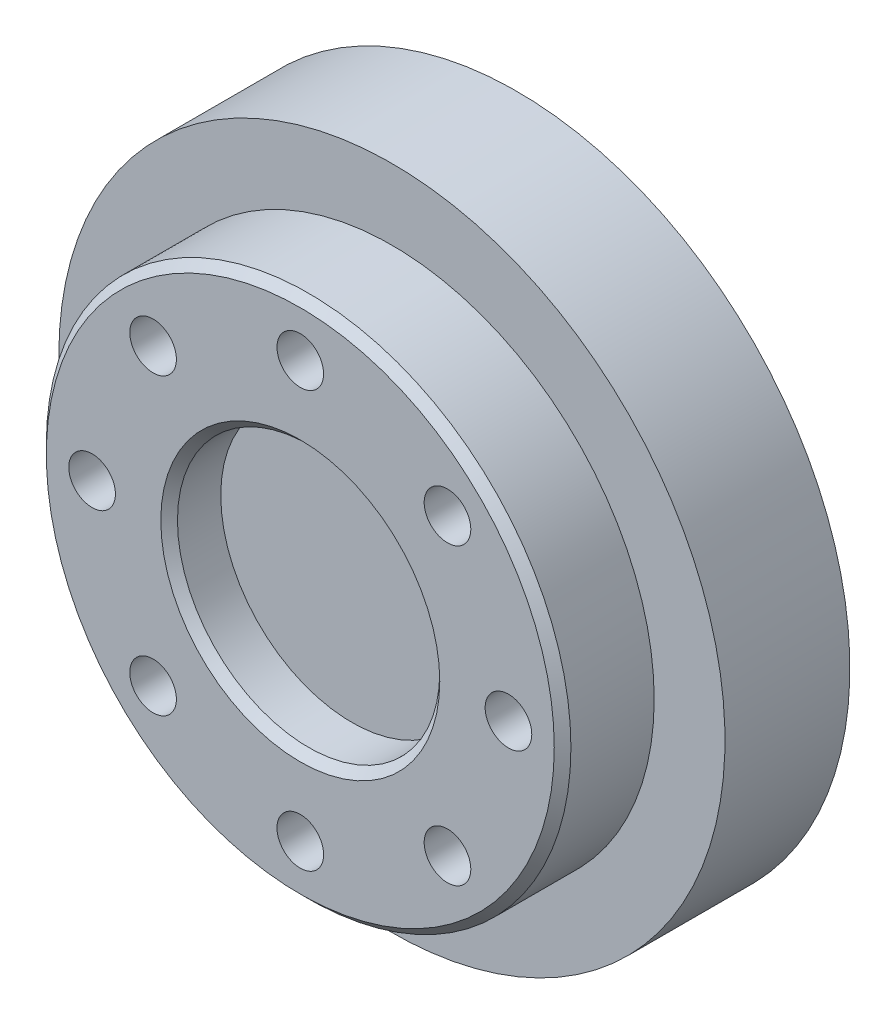
ISO-10303-21;
HEADER;
FILE_DESCRIPTION(('STEP AP214'),'2;1');
FILE_NAME('part.step','',(''),(''),'','','');
FILE_SCHEMA(('AUTOMOTIVE_DESIGN { 1 0 10303 214 1 1 1 1 }'));
ENDSEC;
DATA;
#1=APPLICATION_CONTEXT('core data for automotive mechanical design processes');
#2=APPLICATION_PROTOCOL_DEFINITION('international standard','automotive_design',2000,#1);
#3=PRODUCT_CONTEXT('',#1,'mechanical');
#4=PRODUCT('Part','Part','',(#3));
#5=PRODUCT_RELATED_PRODUCT_CATEGORY('part','',(#4));
#6=PRODUCT_DEFINITION_FORMATION('','',#4);
#7=PRODUCT_DEFINITION_CONTEXT('part definition',#1,'design');
#8=PRODUCT_DEFINITION('design','',#6,#7);
#9=PRODUCT_DEFINITION_SHAPE('','',#8);
#10=(LENGTH_UNIT() NAMED_UNIT(*) SI_UNIT(.MILLI.,.METRE.));
#11=(NAMED_UNIT(*) PLANE_ANGLE_UNIT() SI_UNIT($,.RADIAN.));
#12=(NAMED_UNIT(*) SI_UNIT($,.STERADIAN.) SOLID_ANGLE_UNIT());
#13=UNCERTAINTY_MEASURE_WITH_UNIT(LENGTH_MEASURE(1.E-05),#10,'distance_accuracy_value','');
#14=(GEOMETRIC_REPRESENTATION_CONTEXT(3) GLOBAL_UNCERTAINTY_ASSIGNED_CONTEXT((#13)) GLOBAL_UNIT_ASSIGNED_CONTEXT((#10,
#11,#12)) REPRESENTATION_CONTEXT('',''));
#15=CARTESIAN_POINT('',(0.,0.,0.));
#16=DIRECTION('',(0.,0.,1.));
#17=DIRECTION('',(1.,0.,0.));
#18=AXIS2_PLACEMENT_3D('',#15,#16,#17);
#19=CARTESIAN_POINT('',(0.,0.,-11.));
#20=DIRECTION('',(0.,0.,1.));
#21=DIRECTION('',(1.,0.,0.));
#22=AXIS2_PLACEMENT_3D('',#19,#20,#21);
#23=CYLINDRICAL_SURFACE('',#22,31.5);
#24=CARTESIAN_POINT('',(0.,0.,-1.00000000000004));
#25=DIRECTION('',(0.,0.,1.));
#26=DIRECTION('',(1.,0.,0.));
#27=AXIS2_PLACEMENT_3D('',#24,#25,#26);
#28=CIRCLE('',#27,31.5);
#29=CARTESIAN_POINT('',(31.5,0.,-1.00000000000004));
#30=VERTEX_POINT('',#29);
#31=EDGE_CURVE('E49',#30,#30,#28,.F.);
#32=ORIENTED_EDGE('',*,*,#31,.T.);
#33=EDGE_LOOP('',(#32));
#34=FACE_BOUND('',#33,.T.);
#35=CARTESIAN_POINT('',(0.,0.,-11.));
#36=DIRECTION('',(0.,0.,1.));
#37=DIRECTION('',(1.,0.,0.));
#38=AXIS2_PLACEMENT_3D('',#35,#36,#37);
#39=CIRCLE('',#38,31.5);
#40=CARTESIAN_POINT('',(31.5,0.,-11.));
#41=VERTEX_POINT('',#40);
#42=EDGE_CURVE('E59',#41,#41,#39,.T.);
#43=ORIENTED_EDGE('',*,*,#42,.T.);
#44=EDGE_LOOP('',(#43));
#45=FACE_BOUND('',#44,.T.);
#46=ADVANCED_FACE('F37',(#34,#45),#23,.T.);
#47=CARTESIAN_POINT('',(0.,0.,0.));
#48=DIRECTION('',(0.,0.,1.));
#49=DIRECTION('',(1.,0.,0.));
#50=AXIS2_PLACEMENT_3D('',#47,#48,#49);
#51=PLANE('',#50);
#52=CARTESIAN_POINT('',(0.,0.,0.));
#53=DIRECTION('',(0.,0.,1.));
#54=DIRECTION('',(1.,0.,0.));
#55=AXIS2_PLACEMENT_3D('',#52,#53,#54);
#56=CIRCLE('',#55,16.7500000000001);
#57=CARTESIAN_POINT('',(16.7500000000001,0.,0.));
#58=VERTEX_POINT('',#57);
#59=EDGE_CURVE('E10',#58,#58,#56,.F.);
#60=ORIENTED_EDGE('',*,*,#59,.T.);
#61=EDGE_LOOP('',(#60));
#62=FACE_BOUND('',#61,.T.);
#63=CARTESIAN_POINT('',(0.,0.,0.));
#64=DIRECTION('',(0.,0.,1.));
#65=DIRECTION('',(1.,0.,0.));
#66=AXIS2_PLACEMENT_3D('',#63,#64,#65);
#67=CIRCLE('',#66,30.5);
#68=CARTESIAN_POINT('',(30.5,0.,0.));
#69=VERTEX_POINT('',#68);
#70=EDGE_CURVE('E53',#69,#69,#67,.T.);
#71=ORIENTED_EDGE('',*,*,#70,.T.);
#72=EDGE_LOOP('',(#71));
#73=FACE_BOUND('',#72,.T.);
#74=CARTESIAN_POINT('',(0.,25.,0.));
#75=DIRECTION('',(0.,0.,1.));
#76=DIRECTION('',(1.,0.,0.));
#77=AXIS2_PLACEMENT_3D('',#74,#75,#76);
#78=CIRCLE('',#77,2.8);
#79=CARTESIAN_POINT('',(2.8,25.,0.));
#80=VERTEX_POINT('',#79);
#81=EDGE_CURVE('E106',#80,#80,#78,.T.);
#82=ORIENTED_EDGE('',*,*,#81,.F.);
#83=EDGE_LOOP('',(#82));
#84=FACE_BOUND('',#83,.T.);
#85=CARTESIAN_POINT('',(17.6776695296637,17.6776695296637,0.));
#86=DIRECTION('',(0.,0.,1.));
#87=DIRECTION('',(1.,0.,0.));
#88=AXIS2_PLACEMENT_3D('',#85,#86,#87);
#89=CIRCLE('',#88,2.8);
#90=CARTESIAN_POINT('',(20.4776695296637,17.6776695296637,0.));
#91=VERTEX_POINT('',#90);
#92=EDGE_CURVE('E103',#91,#91,#89,.T.);
#93=ORIENTED_EDGE('',*,*,#92,.F.);
#94=EDGE_LOOP('',(#93));
#95=FACE_BOUND('',#94,.T.);
#96=CARTESIAN_POINT('',(25.,0.,0.));
#97=DIRECTION('',(0.,0.,1.));
#98=DIRECTION('',(1.,0.,0.));
#99=AXIS2_PLACEMENT_3D('',#96,#97,#98);
#100=CIRCLE('',#99,2.8);
#101=CARTESIAN_POINT('',(27.8,0.,0.));
#102=VERTEX_POINT('',#101);
#103=EDGE_CURVE('E97',#102,#102,#100,.T.);
#104=ORIENTED_EDGE('',*,*,#103,.F.);
#105=EDGE_LOOP('',(#104));
#106=FACE_BOUND('',#105,.T.);
#107=CARTESIAN_POINT('',(17.6776695296636,-17.6776695296638,0.));
#108=DIRECTION('',(0.,0.,1.));
#109=DIRECTION('',(1.,0.,0.));
#110=AXIS2_PLACEMENT_3D('',#107,#108,#109);
#111=CIRCLE('',#110,2.8);
#112=CARTESIAN_POINT('',(20.4776695296636,-17.6776695296638,0.));
#113=VERTEX_POINT('',#112);
#114=EDGE_CURVE('E91',#113,#113,#111,.T.);
#115=ORIENTED_EDGE('',*,*,#114,.F.);
#116=EDGE_LOOP('',(#115));
#117=FACE_BOUND('',#116,.T.);
#118=CARTESIAN_POINT('',(-1.74574066942157E-13,-25.,0.));
#119=DIRECTION('',(0.,0.,1.));
#120=DIRECTION('',(1.,0.,0.));
#121=AXIS2_PLACEMENT_3D('',#118,#119,#120);
#122=CIRCLE('',#121,2.8);
#123=CARTESIAN_POINT('',(2.79999999999983,-25.,0.));
#124=VERTEX_POINT('',#123);
#125=EDGE_CURVE('E85',#124,#124,#122,.T.);
#126=ORIENTED_EDGE('',*,*,#125,.F.);
#127=EDGE_LOOP('',(#126));
#128=FACE_BOUND('',#127,.T.);
#129=CARTESIAN_POINT('',(-17.6776695296638,-17.6776695296635,0.));
#130=DIRECTION('',(0.,0.,1.));
#131=DIRECTION('',(1.,0.,0.));
#132=AXIS2_PLACEMENT_3D('',#129,#130,#131);
#133=CIRCLE('',#132,2.8);
#134=CARTESIAN_POINT('',(-14.8776695296638,-17.6776695296635,0.));
#135=VERTEX_POINT('',#134);
#136=EDGE_CURVE('E79',#135,#135,#133,.T.);
#137=ORIENTED_EDGE('',*,*,#136,.F.);
#138=EDGE_LOOP('',(#137));
#139=FACE_BOUND('',#138,.T.);
#140=CARTESIAN_POINT('',(-25.,2.61861100413235E-13,0.));
#141=DIRECTION('',(0.,0.,1.));
#142=DIRECTION('',(1.,0.,0.));
#143=AXIS2_PLACEMENT_3D('',#140,#141,#142);
#144=CIRCLE('',#143,2.8);
#145=CARTESIAN_POINT('',(-22.2,2.61861100413235E-13,0.));
#146=VERTEX_POINT('',#145);
#147=EDGE_CURVE('E73',#146,#146,#144,.T.);
#148=ORIENTED_EDGE('',*,*,#147,.F.);
#149=EDGE_LOOP('',(#148));
#150=FACE_BOUND('',#149,.T.);
#151=CARTESIAN_POINT('',(-17.6776695296635,17.6776695296639,0.));
#152=DIRECTION('',(0.,0.,1.));
#153=DIRECTION('',(1.,0.,0.));
#154=AXIS2_PLACEMENT_3D('',#151,#152,#153);
#155=CIRCLE('',#154,2.8);
#156=CARTESIAN_POINT('',(-14.8776695296635,17.6776695296639,0.));
#157=VERTEX_POINT('',#156);
#158=EDGE_CURVE('E67',#157,#157,#155,.T.);
#159=ORIENTED_EDGE('',*,*,#158,.F.);
#160=EDGE_LOOP('',(#159));
#161=FACE_BOUND('',#160,.T.);
#162=ADVANCED_FACE('F137',(#62,#73,#84,#95,#106,#117,#128,#139,#150,#161),#51,.T.);
#163=CARTESIAN_POINT('',(-17.6776695296635,17.6776695296639,-9.));
#164=DIRECTION('',(0.,0.,1.));
#165=DIRECTION('',(1.,0.,0.));
#166=AXIS2_PLACEMENT_3D('',#163,#164,#165);
#167=CYLINDRICAL_SURFACE('',#166,2.8);
#168=CARTESIAN_POINT('',(-17.6776695296635,17.6776695296639,-9.));
#169=DIRECTION('',(0.,0.,1.));
#170=DIRECTION('',(1.,0.,0.));
#171=AXIS2_PLACEMENT_3D('',#168,#169,#170);
#172=CIRCLE('',#171,2.8);
#173=CARTESIAN_POINT('',(-14.8776695296635,17.6776695296639,-9.));
#174=VERTEX_POINT('',#173);
#175=EDGE_CURVE('E64',#174,#174,#172,.T.);
#176=ORIENTED_EDGE('',*,*,#175,.F.);
#177=EDGE_LOOP('',(#176));
#178=FACE_BOUND('',#177,.T.);
#179=ORIENTED_EDGE('',*,*,#158,.T.);
#180=EDGE_LOOP('',(#179));
#181=FACE_BOUND('',#180,.T.);
#182=ADVANCED_FACE('F143',(#178,#181),#167,.F.);
#183=CARTESIAN_POINT('',(-17.6776695296635,17.6776695296639,-9.));
#184=DIRECTION('',(0.,0.,1.));
#185=DIRECTION('',(1.,0.,0.));
#186=AXIS2_PLACEMENT_3D('',#183,#184,#185);
#187=PLANE('',#186);
#188=ORIENTED_EDGE('',*,*,#175,.T.);
#189=EDGE_LOOP('',(#188));
#190=FACE_BOUND('',#189,.T.);
#191=ADVANCED_FACE('F184',(#190),#187,.T.);
#192=CARTESIAN_POINT('',(-25.,2.61861100413235E-13,-9.));
#193=DIRECTION('',(0.,0.,1.));
#194=DIRECTION('',(1.,0.,0.));
#195=AXIS2_PLACEMENT_3D('',#192,#193,#194);
#196=CYLINDRICAL_SURFACE('',#195,2.8);
#197=CARTESIAN_POINT('',(-25.,2.61861100413235E-13,-9.));
#198=DIRECTION('',(0.,0.,1.));
#199=DIRECTION('',(1.,0.,0.));
#200=AXIS2_PLACEMENT_3D('',#197,#198,#199);
#201=CIRCLE('',#200,2.8);
#202=CARTESIAN_POINT('',(-22.2,2.61861100413235E-13,-9.));
#203=VERTEX_POINT('',#202);
#204=EDGE_CURVE('E70',#203,#203,#201,.T.);
#205=ORIENTED_EDGE('',*,*,#204,.F.);
#206=EDGE_LOOP('',(#205));
#207=FACE_BOUND('',#206,.T.);
#208=ORIENTED_EDGE('',*,*,#147,.T.);
#209=EDGE_LOOP('',(#208));
#210=FACE_BOUND('',#209,.T.);
#211=ADVANCED_FACE('F190',(#207,#210),#196,.F.);
#212=CARTESIAN_POINT('',(-25.,2.61861100413235E-13,-9.));
#213=DIRECTION('',(0.,0.,1.));
#214=DIRECTION('',(1.,0.,0.));
#215=AXIS2_PLACEMENT_3D('',#212,#213,#214);
#216=PLANE('',#215);
#217=ORIENTED_EDGE('',*,*,#204,.T.);
#218=EDGE_LOOP('',(#217));
#219=FACE_BOUND('',#218,.T.);
#220=ADVANCED_FACE('F194',(#219),#216,.T.);
#221=CARTESIAN_POINT('',(-17.6776695296638,-17.6776695296635,-9.));
#222=DIRECTION('',(0.,0.,1.));
#223=DIRECTION('',(1.,0.,0.));
#224=AXIS2_PLACEMENT_3D('',#221,#222,#223);
#225=CYLINDRICAL_SURFACE('',#224,2.8);
#226=CARTESIAN_POINT('',(-17.6776695296638,-17.6776695296635,-9.));
#227=DIRECTION('',(0.,0.,1.));
#228=DIRECTION('',(1.,0.,0.));
#229=AXIS2_PLACEMENT_3D('',#226,#227,#228);
#230=CIRCLE('',#229,2.8);
#231=CARTESIAN_POINT('',(-14.8776695296638,-17.6776695296635,-9.));
#232=VERTEX_POINT('',#231);
#233=EDGE_CURVE('E76',#232,#232,#230,.T.);
#234=ORIENTED_EDGE('',*,*,#233,.F.);
#235=EDGE_LOOP('',(#234));
#236=FACE_BOUND('',#235,.T.);
#237=ORIENTED_EDGE('',*,*,#136,.T.);
#238=EDGE_LOOP('',(#237));
#239=FACE_BOUND('',#238,.T.);
#240=ADVANCED_FACE('F197',(#236,#239),#225,.F.);
#241=CARTESIAN_POINT('',(-17.6776695296638,-17.6776695296635,-9.));
#242=DIRECTION('',(0.,0.,1.));
#243=DIRECTION('',(1.,0.,0.));
#244=AXIS2_PLACEMENT_3D('',#241,#242,#243);
#245=PLANE('',#244);
#246=ORIENTED_EDGE('',*,*,#233,.T.);
#247=EDGE_LOOP('',(#246));
#248=FACE_BOUND('',#247,.T.);
#249=ADVANCED_FACE('F202',(#248),#245,.T.);
#250=CARTESIAN_POINT('',(-1.74574066942157E-13,-25.,-9.));
#251=DIRECTION('',(0.,0.,1.));
#252=DIRECTION('',(1.,0.,0.));
#253=AXIS2_PLACEMENT_3D('',#250,#251,#252);
#254=CYLINDRICAL_SURFACE('',#253,2.8);
#255=CARTESIAN_POINT('',(-1.74574066942157E-13,-25.,-9.));
#256=DIRECTION('',(0.,0.,1.));
#257=DIRECTION('',(1.,0.,0.));
#258=AXIS2_PLACEMENT_3D('',#255,#256,#257);
#259=CIRCLE('',#258,2.8);
#260=CARTESIAN_POINT('',(2.79999999999983,-25.,-9.));
#261=VERTEX_POINT('',#260);
#262=EDGE_CURVE('E82',#261,#261,#259,.T.);
#263=ORIENTED_EDGE('',*,*,#262,.F.);
#264=EDGE_LOOP('',(#263));
#265=FACE_BOUND('',#264,.T.);
#266=ORIENTED_EDGE('',*,*,#125,.T.);
#267=EDGE_LOOP('',(#266));
#268=FACE_BOUND('',#267,.T.);
#269=ADVANCED_FACE('F205',(#265,#268),#254,.F.);
#270=CARTESIAN_POINT('',(-1.74574066942157E-13,-25.,-9.));
#271=DIRECTION('',(0.,0.,1.));
#272=DIRECTION('',(1.,0.,0.));
#273=AXIS2_PLACEMENT_3D('',#270,#271,#272);
#274=PLANE('',#273);
#275=ORIENTED_EDGE('',*,*,#262,.T.);
#276=EDGE_LOOP('',(#275));
#277=FACE_BOUND('',#276,.T.);
#278=ADVANCED_FACE('F210',(#277),#274,.T.);
#279=CARTESIAN_POINT('',(17.6776695296636,-17.6776695296638,-9.));
#280=DIRECTION('',(0.,0.,1.));
#281=DIRECTION('',(1.,0.,0.));
#282=AXIS2_PLACEMENT_3D('',#279,#280,#281);
#283=CYLINDRICAL_SURFACE('',#282,2.8);
#284=CARTESIAN_POINT('',(17.6776695296636,-17.6776695296638,-9.));
#285=DIRECTION('',(0.,0.,1.));
#286=DIRECTION('',(1.,0.,0.));
#287=AXIS2_PLACEMENT_3D('',#284,#285,#286);
#288=CIRCLE('',#287,2.8);
#289=CARTESIAN_POINT('',(20.4776695296636,-17.6776695296638,-9.));
#290=VERTEX_POINT('',#289);
#291=EDGE_CURVE('E88',#290,#290,#288,.T.);
#292=ORIENTED_EDGE('',*,*,#291,.F.);
#293=EDGE_LOOP('',(#292));
#294=FACE_BOUND('',#293,.T.);
#295=ORIENTED_EDGE('',*,*,#114,.T.);
#296=EDGE_LOOP('',(#295));
#297=FACE_BOUND('',#296,.T.);
#298=ADVANCED_FACE('F213',(#294,#297),#283,.F.);
#299=CARTESIAN_POINT('',(17.6776695296636,-17.6776695296638,-9.));
#300=DIRECTION('',(0.,0.,1.));
#301=DIRECTION('',(1.,0.,0.));
#302=AXIS2_PLACEMENT_3D('',#299,#300,#301);
#303=PLANE('',#302);
#304=ORIENTED_EDGE('',*,*,#291,.T.);
#305=EDGE_LOOP('',(#304));
#306=FACE_BOUND('',#305,.T.);
#307=ADVANCED_FACE('F218',(#306),#303,.T.);
#308=CARTESIAN_POINT('',(25.,0.,-9.));
#309=DIRECTION('',(0.,0.,1.));
#310=DIRECTION('',(1.,0.,0.));
#311=AXIS2_PLACEMENT_3D('',#308,#309,#310);
#312=CYLINDRICAL_SURFACE('',#311,2.8);
#313=CARTESIAN_POINT('',(25.,0.,-9.));
#314=DIRECTION('',(0.,0.,1.));
#315=DIRECTION('',(1.,0.,0.));
#316=AXIS2_PLACEMENT_3D('',#313,#314,#315);
#317=CIRCLE('',#316,2.8);
#318=CARTESIAN_POINT('',(27.8,0.,-9.));
#319=VERTEX_POINT('',#318);
#320=EDGE_CURVE('E94',#319,#319,#317,.T.);
#321=ORIENTED_EDGE('',*,*,#320,.F.);
#322=EDGE_LOOP('',(#321));
#323=FACE_BOUND('',#322,.T.);
#324=ORIENTED_EDGE('',*,*,#103,.T.);
#325=EDGE_LOOP('',(#324));
#326=FACE_BOUND('',#325,.T.);
#327=ADVANCED_FACE('F221',(#323,#326),#312,.F.);
#328=CARTESIAN_POINT('',(25.,0.,-9.));
#329=DIRECTION('',(0.,0.,1.));
#330=DIRECTION('',(1.,0.,0.));
#331=AXIS2_PLACEMENT_3D('',#328,#329,#330);
#332=PLANE('',#331);
#333=ORIENTED_EDGE('',*,*,#320,.T.);
#334=EDGE_LOOP('',(#333));
#335=FACE_BOUND('',#334,.T.);
#336=ADVANCED_FACE('F226',(#335),#332,.T.);
#337=CARTESIAN_POINT('',(17.6776695296637,17.6776695296637,-9.));
#338=DIRECTION('',(0.,0.,1.));
#339=DIRECTION('',(1.,0.,0.));
#340=AXIS2_PLACEMENT_3D('',#337,#338,#339);
#341=CYLINDRICAL_SURFACE('',#340,2.8);
#342=CARTESIAN_POINT('',(17.6776695296637,17.6776695296637,-9.));
#343=DIRECTION('',(0.,0.,1.));
#344=DIRECTION('',(1.,0.,0.));
#345=AXIS2_PLACEMENT_3D('',#342,#343,#344);
#346=CIRCLE('',#345,2.8);
#347=CARTESIAN_POINT('',(20.4776695296637,17.6776695296637,-9.));
#348=VERTEX_POINT('',#347);
#349=EDGE_CURVE('E100',#348,#348,#346,.T.);
#350=ORIENTED_EDGE('',*,*,#349,.F.);
#351=EDGE_LOOP('',(#350));
#352=FACE_BOUND('',#351,.T.);
#353=ORIENTED_EDGE('',*,*,#92,.T.);
#354=EDGE_LOOP('',(#353));
#355=FACE_BOUND('',#354,.T.);
#356=ADVANCED_FACE('F229',(#352,#355),#341,.F.);
#357=CARTESIAN_POINT('',(17.6776695296637,17.6776695296637,-9.));
#358=DIRECTION('',(0.,0.,1.));
#359=DIRECTION('',(1.,0.,0.));
#360=AXIS2_PLACEMENT_3D('',#357,#358,#359);
#361=PLANE('',#360);
#362=ORIENTED_EDGE('',*,*,#349,.T.);
#363=EDGE_LOOP('',(#362));
#364=FACE_BOUND('',#363,.T.);
#365=ADVANCED_FACE('F234',(#364),#361,.T.);
#366=CARTESIAN_POINT('',(0.,25.,-9.));
#367=DIRECTION('',(0.,0.,1.));
#368=DIRECTION('',(1.,0.,0.));
#369=AXIS2_PLACEMENT_3D('',#366,#367,#368);
#370=CYLINDRICAL_SURFACE('',#369,2.8);
#371=CARTESIAN_POINT('',(0.,25.,-9.));
#372=DIRECTION('',(0.,0.,1.));
#373=DIRECTION('',(1.,0.,0.));
#374=AXIS2_PLACEMENT_3D('',#371,#372,#373);
#375=CIRCLE('',#374,2.8);
#376=CARTESIAN_POINT('',(2.8,25.,-9.));
#377=VERTEX_POINT('',#376);
#378=EDGE_CURVE('E58',#377,#377,#375,.T.);
#379=ORIENTED_EDGE('',*,*,#378,.F.);
#380=EDGE_LOOP('',(#379));
#381=FACE_BOUND('',#380,.T.);
#382=ORIENTED_EDGE('',*,*,#81,.T.);
#383=EDGE_LOOP('',(#382));
#384=FACE_BOUND('',#383,.T.);
#385=ADVANCED_FACE('F237',(#381,#384),#370,.F.);
#386=CARTESIAN_POINT('',(0.,25.,-9.));
#387=DIRECTION('',(0.,0.,1.));
#388=DIRECTION('',(1.,0.,0.));
#389=AXIS2_PLACEMENT_3D('',#386,#387,#388);
#390=PLANE('',#389);
#391=ORIENTED_EDGE('',*,*,#378,.T.);
#392=EDGE_LOOP('',(#391));
#393=FACE_BOUND('',#392,.T.);
#394=ADVANCED_FACE('F244',(#393),#390,.T.);
#395=CARTESIAN_POINT('',(0.,0.,-6.2));
#396=DIRECTION('',(0.,0.,1.));
#397=DIRECTION('',(1.,0.,0.));
#398=AXIS2_PLACEMENT_3D('',#395,#396,#397);
#399=CYLINDRICAL_SURFACE('',#398,15.75);
#400=CARTESIAN_POINT('',(0.,0.,-1.00000000000005));
#401=DIRECTION('',(0.,0.,1.));
#402=DIRECTION('',(1.,0.,0.));
#403=AXIS2_PLACEMENT_3D('',#400,#401,#402);
#404=CIRCLE('',#403,15.75);
#405=CARTESIAN_POINT('',(15.75,0.,-1.00000000000005));
#406=VERTEX_POINT('',#405);
#407=EDGE_CURVE('E45',#406,#406,#404,.T.);
#408=CARTESIAN_POINT('',(0.,0.,-6.2));
#409=DIRECTION('',(0.,0.,1.));
#410=DIRECTION('',(1.,0.,0.));
#411=AXIS2_PLACEMENT_3D('',#408,#409,#410);
#412=CIRCLE('',#411,15.75);
#413=CARTESIAN_POINT('',(15.75,0.,-6.2));
#414=VERTEX_POINT('',#413);
#415=EDGE_CURVE('E62',#414,#414,#412,.T.);
#416=CARTESIAN_POINT('',(15.75,0.,-1.00000000000005));
#417=CARTESIAN_POINT('',(15.75,0.,-1.05416666666672));
#418=CARTESIAN_POINT('',(15.75,0.,-1.10833333333339));
#419=CARTESIAN_POINT('',(15.75,0.,-1.21666666666672));
#420=CARTESIAN_POINT('',(15.75,0.,-1.27083333333338));
#421=CARTESIAN_POINT('',(15.75,0.,-1.37916666666672));
#422=CARTESIAN_POINT('',(15.75,0.,-1.43333333333338));
#423=CARTESIAN_POINT('',(15.75,0.,-1.54166666666671));
#424=CARTESIAN_POINT('',(15.75,0.,-1.59583333333338));
#425=CARTESIAN_POINT('',(15.75,0.,-1.70416666666671));
#426=CARTESIAN_POINT('',(15.75,0.,-1.75833333333338));
#427=CARTESIAN_POINT('',(15.75,0.,-1.86666666666671));
#428=CARTESIAN_POINT('',(15.75,0.,-1.92083333333338));
#429=CARTESIAN_POINT('',(15.75,0.,-2.02916666666671));
#430=CARTESIAN_POINT('',(15.75,0.,-2.08333333333338));
#431=CARTESIAN_POINT('',(15.75,0.,-2.19166666666671));
#432=CARTESIAN_POINT('',(15.75,0.,-2.24583333333337));
#433=CARTESIAN_POINT('',(15.75,0.,-2.35416666666671));
#434=CARTESIAN_POINT('',(15.75,0.,-2.40833333333337));
#435=CARTESIAN_POINT('',(15.75,0.,-2.5166666666667));
#436=CARTESIAN_POINT('',(15.75,0.,-2.57083333333337));
#437=CARTESIAN_POINT('',(15.75,0.,-2.6791666666667));
#438=CARTESIAN_POINT('',(15.75,0.,-2.73333333333337));
#439=CARTESIAN_POINT('',(15.75,0.,-2.8416666666667));
#440=CARTESIAN_POINT('',(15.75,0.,-2.89583333333337));
#441=CARTESIAN_POINT('',(15.75,0.,-3.0041666666667));
#442=CARTESIAN_POINT('',(15.75,0.,-3.05833333333337));
#443=CARTESIAN_POINT('',(15.75,0.,-3.1666666666667));
#444=CARTESIAN_POINT('',(15.75,0.,-3.22083333333336));
#445=CARTESIAN_POINT('',(15.75,0.,-3.3291666666667));
#446=CARTESIAN_POINT('',(15.75,0.,-3.38333333333336));
#447=CARTESIAN_POINT('',(15.75,0.,-3.49166666666669));
#448=CARTESIAN_POINT('',(15.75,0.,-3.54583333333336));
#449=CARTESIAN_POINT('',(15.75,0.,-3.65416666666669));
#450=CARTESIAN_POINT('',(15.75,0.,-3.70833333333336));
#451=CARTESIAN_POINT('',(15.75,0.,-3.81666666666669));
#452=CARTESIAN_POINT('',(15.75,0.,-3.87083333333336));
#453=CARTESIAN_POINT('',(15.75,0.,-3.97916666666669));
#454=CARTESIAN_POINT('',(15.75,0.,-4.03333333333336));
#455=CARTESIAN_POINT('',(15.75,0.,-4.14166666666669));
#456=CARTESIAN_POINT('',(15.75,0.,-4.19583333333335));
#457=CARTESIAN_POINT('',(15.75,0.,-4.30416666666669));
#458=CARTESIAN_POINT('',(15.75,0.,-4.35833333333335));
#459=CARTESIAN_POINT('',(15.75,0.,-4.46666666666668));
#460=CARTESIAN_POINT('',(15.75,0.,-4.52083333333335));
#461=CARTESIAN_POINT('',(15.75,0.,-4.62916666666668));
#462=CARTESIAN_POINT('',(15.75,0.,-4.68333333333335));
#463=CARTESIAN_POINT('',(15.75,0.,-4.79166666666668));
#464=CARTESIAN_POINT('',(15.75,0.,-4.84583333333335));
#465=CARTESIAN_POINT('',(15.75,0.,-4.95416666666668));
#466=CARTESIAN_POINT('',(15.75,0.,-5.00833333333335));
#467=CARTESIAN_POINT('',(15.75,0.,-5.11666666666668));
#468=CARTESIAN_POINT('',(15.75,0.,-5.17083333333334));
#469=CARTESIAN_POINT('',(15.75,0.,-5.27916666666668));
#470=CARTESIAN_POINT('',(15.75,0.,-5.33333333333334));
#471=CARTESIAN_POINT('',(15.75,0.,-5.44166666666667));
#472=CARTESIAN_POINT('',(15.75,0.,-5.49583333333334));
#473=CARTESIAN_POINT('',(15.75,0.,-5.60416666666667));
#474=CARTESIAN_POINT('',(15.75,0.,-5.65833333333334));
#475=CARTESIAN_POINT('',(15.75,0.,-5.76666666666667));
#476=CARTESIAN_POINT('',(15.75,0.,-5.82083333333334));
#477=CARTESIAN_POINT('',(15.75,0.,-5.92916666666667));
#478=CARTESIAN_POINT('',(15.75,0.,-5.98333333333334));
#479=CARTESIAN_POINT('',(15.75,0.,-6.09166666666667));
#480=CARTESIAN_POINT('',(15.75,0.,-6.14583333333333));
#481=CARTESIAN_POINT('',(15.75,0.,-6.2));
#482=B_SPLINE_CURVE_WITH_KNOTS('',3,(#416,#417,#418,#419,#420,#421,#422,#423,#424,#425,#426,
#427,#428,#429,#430,#431,#432,#433,#434,#435,#436,#437,#438,#439,#440,#441,#442,#443,#444,#445,
#446,#447,#448,#449,#450,#451,#452,#453,#454,#455,#456,#457,#458,#459,#460,#461,#462,#463,#464,
#465,#466,#467,#468,#469,#470,#471,#472,#473,#474,#475,#476,#477,#478,#479,#480,#481),
.UNSPECIFIED.,.F.,.F.,(4,2,2,2,2,2,2,2,2,2,2,2,2,2,2,2,2,2,2,2,2,2,2,2,2,2,2,2,2,2,2,2,4),(0.,
0.162499999999999,0.324999999999997,0.487499999999995,0.649999999999993,0.812499999999992,
0.974999999999991,1.13749999999999,1.29999999999999,1.46249999999999,1.62499999999998,
1.78749999999998,1.94999999999998,2.11249999999998,2.27499999999998,2.43749999999998,
2.59999999999997,2.76249999999997,2.92499999999997,3.08749999999997,3.24999999999997,
3.41249999999997,3.57499999999996,3.73749999999996,3.89999999999996,4.06249999999996,
4.22499999999996,4.38749999999996,4.54999999999995,4.71249999999995,4.87499999999995,
5.03749999999995,5.19999999999995),.UNSPECIFIED.);
#483=EDGE_CURVE('BSEAM159',#406,#414,#482,.T.);
#484=ORIENTED_EDGE('',*,*,#407,.T.);
#485=ORIENTED_EDGE('',*,*,#415,.F.);
#486=ORIENTED_EDGE('',*,*,#483,.T.);
#487=ORIENTED_EDGE('',*,*,#483,.F.);
#488=EDGE_LOOP('',(#484,#486,#485,#487));
#489=FACE_BOUND('',#488,.T.);
#490=ADVANCED_FACE('F159',(#489),#399,.F.);
#491=CARTESIAN_POINT('',(0.,0.,-6.2));
#492=DIRECTION('',(0.,0.,1.));
#493=DIRECTION('',(1.,0.,0.));
#494=AXIS2_PLACEMENT_3D('',#491,#492,#493);
#495=PLANE('',#494);
#496=ORIENTED_EDGE('',*,*,#415,.T.);
#497=EDGE_LOOP('',(#496));
#498=FACE_BOUND('',#497,.T.);
#499=ADVANCED_FACE('F152',(#498),#495,.T.);
#500=CARTESIAN_POINT('',(0.,0.,0.));
#501=DIRECTION('',(0.,0.,-1.));
#502=DIRECTION('',(-1.,0.,0.));
#503=AXIS2_PLACEMENT_3D('',#500,#501,#502);
#504=CONICAL_SURFACE('',#503,30.5,0.785398163397445);
#505=ORIENTED_EDGE('',*,*,#31,.F.);
#506=EDGE_LOOP('',(#505));
#507=FACE_BOUND('',#506,.T.);
#508=ORIENTED_EDGE('',*,*,#70,.F.);
#509=EDGE_LOOP('',(#508));
#510=FACE_BOUND('',#509,.T.);
#511=ADVANCED_FACE('F148',(#507,#510),#504,.T.);
#512=CARTESIAN_POINT('',(0.,0.,-1.00000000000005));
#513=DIRECTION('',(0.,0.,1.));
#514=DIRECTION('',(1.,0.,0.));
#515=AXIS2_PLACEMENT_3D('',#512,#513,#514);
#516=CONICAL_SURFACE('',#515,15.75,0.785398163397448);
#517=ORIENTED_EDGE('',*,*,#59,.F.);
#518=EDGE_LOOP('',(#517));
#519=FACE_BOUND('',#518,.T.);
#520=ORIENTED_EDGE('',*,*,#407,.F.);
#521=EDGE_LOOP('',(#520));
#522=FACE_BOUND('',#521,.T.);
#523=ADVANCED_FACE('F40',(#519,#522),#516,.F.);
#524=CARTESIAN_POINT('',(0.,0.,-26.));
#525=DIRECTION('',(0.,0.,1.));
#526=DIRECTION('',(1.,0.,0.));
#527=AXIS2_PLACEMENT_3D('',#524,#525,#526);
#528=CYLINDRICAL_SURFACE('',#527,40.);
#529=CARTESIAN_POINT('',(0.,0.,-26.));
#530=DIRECTION('',(0.,0.,-1.));
#531=DIRECTION('',(-1.,0.,0.));
#532=AXIS2_PLACEMENT_3D('',#529,#530,#531);
#533=CIRCLE('',#532,40.);
#534=CARTESIAN_POINT('',(-40.,0.,-26.));
#535=VERTEX_POINT('',#534);
#536=EDGE_CURVE('E63',#535,#535,#533,.T.);
#537=ORIENTED_EDGE('',*,*,#536,.F.);
#538=EDGE_LOOP('',(#537));
#539=FACE_BOUND('',#538,.T.);
#540=CARTESIAN_POINT('',(0.,0.,-11.));
#541=DIRECTION('',(0.,0.,-1.));
#542=DIRECTION('',(-1.,0.,0.));
#543=AXIS2_PLACEMENT_3D('',#540,#541,#542);
#544=CIRCLE('',#543,40.);
#545=CARTESIAN_POINT('',(-40.,0.,-11.));
#546=VERTEX_POINT('',#545);
#547=EDGE_CURVE('E113',#546,#546,#544,.T.);
#548=ORIENTED_EDGE('',*,*,#547,.T.);
#549=EDGE_LOOP('',(#548));
#550=FACE_BOUND('',#549,.T.);
#551=ADVANCED_FACE('F121',(#539,#550),#528,.T.);
#552=CARTESIAN_POINT('',(0.,0.,-26.));
#553=DIRECTION('',(0.,0.,-1.));
#554=DIRECTION('',(-1.,0.,0.));
#555=AXIS2_PLACEMENT_3D('',#552,#553,#554);
#556=PLANE('',#555);
#557=ORIENTED_EDGE('',*,*,#536,.T.);
#558=EDGE_LOOP('',(#557));
#559=FACE_BOUND('',#558,.T.);
#560=ADVANCED_FACE('F119',(#559),#556,.T.);
#561=CARTESIAN_POINT('',(0.,0.,-11.));
#562=DIRECTION('',(0.,0.,-1.));
#563=DIRECTION('',(-1.,0.,0.));
#564=AXIS2_PLACEMENT_3D('',#561,#562,#563);
#565=PLANE('',#564);
#566=ORIENTED_EDGE('',*,*,#42,.F.);
#567=EDGE_LOOP('',(#566));
#568=FACE_BOUND('',#567,.T.);
#569=ORIENTED_EDGE('',*,*,#547,.F.);
#570=EDGE_LOOP('',(#569));
#571=FACE_BOUND('',#570,.T.);
#572=ADVANCED_FACE('F127',(#568,#571),#565,.F.);
#573=CLOSED_SHELL('',(#46,#162,#182,#191,#211,#220,#240,#249,#269,#278,#298,#307,#327,#336,#356,
#365,#385,#394,#490,#499,#511,#523,#551,#560,#572));
#574=MANIFOLD_SOLID_BREP('B2',#573);
#575=ADVANCED_BREP_SHAPE_REPRESENTATION('',(#18,#574),#14);
#576=SHAPE_DEFINITION_REPRESENTATION(#9,#575);
ENDSEC;
END-ISO-10303-21;
